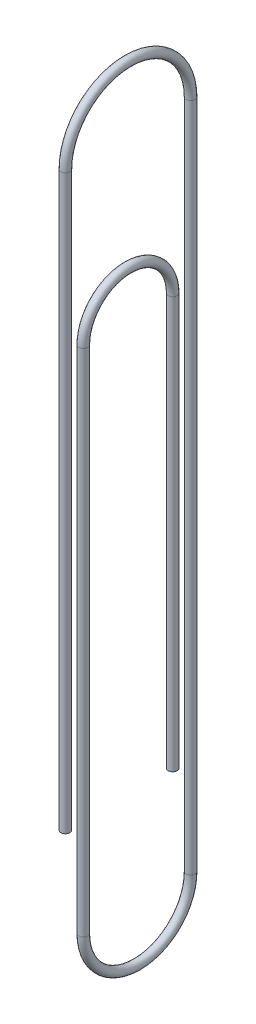
ISO-10303-21;
HEADER;
FILE_DESCRIPTION(('STEP AP214'),'2;1');
FILE_NAME('part.step','',(''),(''),'','','');
FILE_SCHEMA(('AUTOMOTIVE_DESIGN { 1 0 10303 214 1 1 1 1 }'));
ENDSEC;
DATA;
#1=APPLICATION_CONTEXT('core data for automotive mechanical design processes');
#2=APPLICATION_PROTOCOL_DEFINITION('international standard','automotive_design',2000,#1);
#3=PRODUCT_CONTEXT('',#1,'mechanical');
#4=PRODUCT('Part','Part','',(#3));
#5=PRODUCT_RELATED_PRODUCT_CATEGORY('part','',(#4));
#6=PRODUCT_DEFINITION_FORMATION('','',#4);
#7=PRODUCT_DEFINITION_CONTEXT('part definition',#1,'design');
#8=PRODUCT_DEFINITION('design','',#6,#7);
#9=PRODUCT_DEFINITION_SHAPE('','',#8);
#10=(LENGTH_UNIT() NAMED_UNIT(*) SI_UNIT(.MILLI.,.METRE.));
#11=(NAMED_UNIT(*) PLANE_ANGLE_UNIT() SI_UNIT($,.RADIAN.));
#12=(NAMED_UNIT(*) SI_UNIT($,.STERADIAN.) SOLID_ANGLE_UNIT());
#13=UNCERTAINTY_MEASURE_WITH_UNIT(LENGTH_MEASURE(1.E-05),#10,'distance_accuracy_value','');
#14=(GEOMETRIC_REPRESENTATION_CONTEXT(3) GLOBAL_UNCERTAINTY_ASSIGNED_CONTEXT((#13)) GLOBAL_UNIT_ASSIGNED_CONTEXT((#10,
#11,#12)) REPRESENTATION_CONTEXT('',''));
#15=CARTESIAN_POINT('',(0.,0.,0.));
#16=DIRECTION('',(0.,0.,1.));
#17=DIRECTION('',(1.,0.,0.));
#18=AXIS2_PLACEMENT_3D('',#15,#16,#17);
#19=CARTESIAN_POINT('',(0.,0.,0.));
#20=DIRECTION('',(0.,1.,0.));
#21=DIRECTION('',(0.,0.,1.));
#22=AXIS2_PLACEMENT_3D('',#19,#20,#21);
#23=PLANE('',#22);
#24=CARTESIAN_POINT('',(0.,0.,0.));
#25=DIRECTION('',(0.,1.,0.));
#26=DIRECTION('',(0.,0.,1.));
#27=AXIS2_PLACEMENT_3D('',#24,#25,#26);
#28=CIRCLE('',#27,0.25);
#29=CARTESIAN_POINT('',(0.,0.,0.25));
#30=VERTEX_POINT('',#29);
#31=EDGE_CURVE('E63',#30,#30,#28,.T.);
#32=ORIENTED_EDGE('',*,*,#31,.F.);
#33=EDGE_LOOP('',(#32));
#34=FACE_BOUND('',#33,.T.);
#35=ADVANCED_FACE('F40',(#34),#23,.F.);
#36=CARTESIAN_POINT('',(0.,0.,-6.00000000000001));
#37=DIRECTION('',(0.,-1.,0.));
#38=DIRECTION('',(0.,0.,-1.));
#39=AXIS2_PLACEMENT_3D('',#36,#37,#38);
#40=PLANE('',#39);
#41=CARTESIAN_POINT('',(0.,0.,-6.00000000000001));
#42=DIRECTION('',(0.,-1.,0.));
#43=DIRECTION('',(0.,0.,-1.));
#44=AXIS2_PLACEMENT_3D('',#41,#42,#43);
#45=CIRCLE('',#44,0.25);
#46=CARTESIAN_POINT('',(0.,0.,-6.25000000000001));
#47=VERTEX_POINT('',#46);
#48=EDGE_CURVE('E10',#47,#47,#45,.T.);
#49=ORIENTED_EDGE('',*,*,#48,.T.);
#50=EDGE_LOOP('',(#49));
#51=FACE_BOUND('',#50,.T.);
#52=ADVANCED_FACE('F75',(#51),#40,.T.);
#53=CARTESIAN_POINT('',(0.,0.,0.));
#54=DIRECTION('',(0.,1.,0.));
#55=DIRECTION('',(0.,0.,1.));
#56=AXIS2_PLACEMENT_3D('',#53,#54,#55);
#57=CYLINDRICAL_SURFACE('',#56,0.25);
#58=CARTESIAN_POINT('',(0.,32.,0.));
#59=DIRECTION('',(0.,1.,0.));
#60=DIRECTION('',(0.,0.,1.));
#61=AXIS2_PLACEMENT_3D('',#58,#59,#60);
#62=CIRCLE('',#61,0.25);
#63=CARTESIAN_POINT('',(0.,32.,0.250000000000001));
#64=VERTEX_POINT('',#63);
#65=EDGE_CURVE('E65',#64,#64,#62,.T.);
#66=ORIENTED_EDGE('',*,*,#65,.F.);
#67=EDGE_LOOP('',(#66));
#68=FACE_BOUND('',#67,.T.);
#69=ORIENTED_EDGE('',*,*,#31,.T.);
#70=EDGE_LOOP('',(#69));
#71=FACE_BOUND('',#70,.T.);
#72=ADVANCED_FACE('F68',(#68,#71),#57,.T.);
#73=CARTESIAN_POINT('',(0.,32.,-3.5));
#74=DIRECTION('',(-1.,0.,0.));
#75=DIRECTION('',(0.,0.,1.));
#76=AXIS2_PLACEMENT_3D('',#73,#74,#75);
#77=TOROIDAL_SURFACE('',#76,3.5,0.25);
#78=CARTESIAN_POINT('',(0.,32.,-7.));
#79=DIRECTION('',(0.,-1.,0.));
#80=DIRECTION('',(0.,0.,-1.));
#81=AXIS2_PLACEMENT_3D('',#78,#79,#80);
#82=CIRCLE('',#81,0.25);
#83=CARTESIAN_POINT('',(0.,32.,-7.25));
#84=VERTEX_POINT('',#83);
#85=EDGE_CURVE('E56',#84,#84,#82,.T.);
#86=CARTESIAN_POINT('',(0.,32.,-3.5));
#87=DIRECTION('',(-1.,0.,0.));
#88=DIRECTION('',(0.,0.,1.));
#89=AXIS2_PLACEMENT_3D('',#86,#87,#88);
#90=CIRCLE('',#89,3.75);
#91=EDGE_CURVE('',#64,#84,#90,.T.);
#92=ORIENTED_EDGE('',*,*,#65,.T.);
#93=ORIENTED_EDGE('',*,*,#85,.F.);
#94=ORIENTED_EDGE('',*,*,#91,.T.);
#95=ORIENTED_EDGE('',*,*,#91,.F.);
#96=EDGE_LOOP('',(#92,#94,#93,#95));
#97=FACE_BOUND('',#96,.T.);
#98=ADVANCED_FACE('F98',(#97),#77,.T.);
#99=CARTESIAN_POINT('',(0.,32.,-7.));
#100=DIRECTION('',(0.,-1.,0.));
#101=DIRECTION('',(0.,0.,-1.));
#102=AXIS2_PLACEMENT_3D('',#99,#100,#101);
#103=CYLINDRICAL_SURFACE('',#102,0.25);
#104=CARTESIAN_POINT('',(0.,-5.5,-7.));
#105=DIRECTION('',(0.,-1.,0.));
#106=DIRECTION('',(0.,0.,-1.));
#107=AXIS2_PLACEMENT_3D('',#104,#105,#106);
#108=CIRCLE('',#107,0.25);
#109=CARTESIAN_POINT('',(0.,-5.5,-7.25));
#110=VERTEX_POINT('',#109);
#111=EDGE_CURVE('E57',#110,#110,#108,.T.);
#112=ORIENTED_EDGE('',*,*,#111,.F.);
#113=EDGE_LOOP('',(#112));
#114=FACE_BOUND('',#113,.T.);
#115=ORIENTED_EDGE('',*,*,#85,.T.);
#116=EDGE_LOOP('',(#115));
#117=FACE_BOUND('',#116,.T.);
#118=ADVANCED_FACE('F94',(#114,#117),#103,.T.);
#119=CARTESIAN_POINT('',(0.,-5.5,-4.));
#120=DIRECTION('',(-1.,0.,0.));
#121=DIRECTION('',(0.,0.,1.));
#122=AXIS2_PLACEMENT_3D('',#119,#120,#121);
#123=TOROIDAL_SURFACE('',#122,3.,0.25);
#124=CARTESIAN_POINT('',(0.,-5.5,-1.));
#125=DIRECTION('',(0.,1.,0.));
#126=DIRECTION('',(0.,0.,1.));
#127=AXIS2_PLACEMENT_3D('',#124,#125,#126);
#128=CIRCLE('',#127,0.25);
#129=CARTESIAN_POINT('',(0.,-5.5,-0.750000000000004));
#130=VERTEX_POINT('',#129);
#131=EDGE_CURVE('E51',#130,#130,#128,.T.);
#132=CARTESIAN_POINT('',(0.,-5.5,-4.));
#133=DIRECTION('',(-1.,0.,0.));
#134=DIRECTION('',(0.,0.,1.));
#135=AXIS2_PLACEMENT_3D('',#132,#133,#134);
#136=CIRCLE('',#135,3.25);
#137=EDGE_CURVE('',#110,#130,#136,.T.);
#138=ORIENTED_EDGE('',*,*,#111,.T.);
#139=ORIENTED_EDGE('',*,*,#131,.F.);
#140=ORIENTED_EDGE('',*,*,#137,.T.);
#141=ORIENTED_EDGE('',*,*,#137,.F.);
#142=EDGE_LOOP('',(#138,#140,#139,#141));
#143=FACE_BOUND('',#142,.T.);
#144=ADVANCED_FACE('F89',(#143),#123,.T.);
#145=CARTESIAN_POINT('',(0.,-5.5,-1.));
#146=DIRECTION('',(0.,1.,0.));
#147=DIRECTION('',(0.,0.,1.));
#148=AXIS2_PLACEMENT_3D('',#145,#146,#147);
#149=CYLINDRICAL_SURFACE('',#148,0.25);
#150=CARTESIAN_POINT('',(0.,23.,-1.00000000000001));
#151=DIRECTION('',(0.,1.,0.));
#152=DIRECTION('',(0.,0.,1.));
#153=AXIS2_PLACEMENT_3D('',#150,#151,#152);
#154=CIRCLE('',#153,0.25);
#155=CARTESIAN_POINT('',(0.,23.,-0.750000000000008));
#156=VERTEX_POINT('',#155);
#157=EDGE_CURVE('E50',#156,#156,#154,.T.);
#158=ORIENTED_EDGE('',*,*,#157,.F.);
#159=EDGE_LOOP('',(#158));
#160=FACE_BOUND('',#159,.T.);
#161=ORIENTED_EDGE('',*,*,#131,.T.);
#162=EDGE_LOOP('',(#161));
#163=FACE_BOUND('',#162,.T.);
#164=ADVANCED_FACE('F83',(#160,#163),#149,.T.);
#165=CARTESIAN_POINT('',(0.,23.,-3.50000000000001));
#166=DIRECTION('',(-1.,0.,0.));
#167=DIRECTION('',(0.,0.,1.));
#168=AXIS2_PLACEMENT_3D('',#165,#166,#167);
#169=TOROIDAL_SURFACE('',#168,2.5,0.25);
#170=CARTESIAN_POINT('',(0.,23.,-6.00000000000001));
#171=DIRECTION('',(0.,-1.,0.));
#172=DIRECTION('',(0.,0.,-1.));
#173=AXIS2_PLACEMENT_3D('',#170,#171,#172);
#174=CIRCLE('',#173,0.25);
#175=CARTESIAN_POINT('',(0.,23.,-6.25000000000001));
#176=VERTEX_POINT('',#175);
#177=EDGE_CURVE('E43',#176,#176,#174,.T.);
#178=CARTESIAN_POINT('',(0.,23.,-3.50000000000001));
#179=DIRECTION('',(-1.,0.,0.));
#180=DIRECTION('',(0.,0.,1.));
#181=AXIS2_PLACEMENT_3D('',#178,#179,#180);
#182=CIRCLE('',#181,2.75);
#183=EDGE_CURVE('',#156,#176,#182,.T.);
#184=ORIENTED_EDGE('',*,*,#157,.T.);
#185=ORIENTED_EDGE('',*,*,#177,.F.);
#186=ORIENTED_EDGE('',*,*,#183,.T.);
#187=ORIENTED_EDGE('',*,*,#183,.F.);
#188=EDGE_LOOP('',(#184,#186,#185,#187));
#189=FACE_BOUND('',#188,.T.);
#190=ADVANCED_FACE('F79',(#189),#169,.T.);
#191=CARTESIAN_POINT('',(0.,23.,-6.00000000000001));
#192=DIRECTION('',(0.,-1.,0.));
#193=DIRECTION('',(0.,0.,-1.));
#194=AXIS2_PLACEMENT_3D('',#191,#192,#193);
#195=CYLINDRICAL_SURFACE('',#194,0.25);
#196=ORIENTED_EDGE('',*,*,#48,.F.);
#197=EDGE_LOOP('',(#196));
#198=FACE_BOUND('',#197,.T.);
#199=ORIENTED_EDGE('',*,*,#177,.T.);
#200=EDGE_LOOP('',(#199));
#201=FACE_BOUND('',#200,.T.);
#202=ADVANCED_FACE('F77',(#198,#201),#195,.T.);
#203=CLOSED_SHELL('',(#35,#52,#72,#98,#118,#144,#164,#190,#202));
#204=MANIFOLD_SOLID_BREP('B2',#203);
#205=ADVANCED_BREP_SHAPE_REPRESENTATION('',(#18,#204),#14);
#206=SHAPE_DEFINITION_REPRESENTATION(#9,#205);
ENDSEC;
END-ISO-10303-21;
